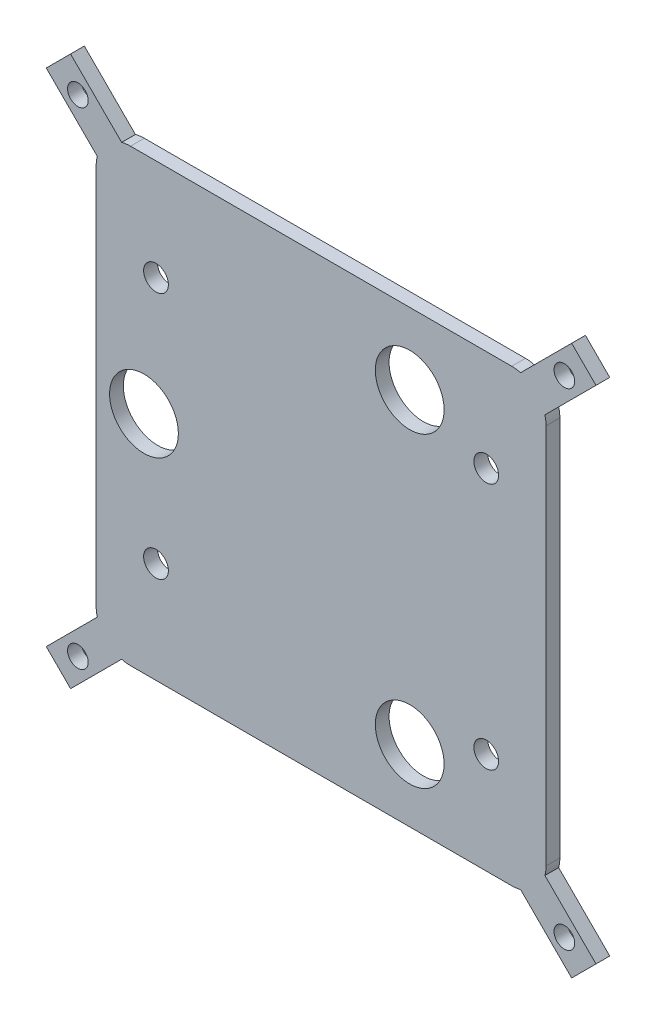
ISO-10303-21;
HEADER;
FILE_DESCRIPTION(('STEP AP214'),'2;1');
FILE_NAME('part.step','',(''),(''),'','','');
FILE_SCHEMA(('AUTOMOTIVE_DESIGN { 1 0 10303 214 1 1 1 1 }'));
ENDSEC;
DATA;
#1=APPLICATION_CONTEXT('core data for automotive mechanical design processes');
#2=APPLICATION_PROTOCOL_DEFINITION('international standard','automotive_design',2000,#1);
#3=PRODUCT_CONTEXT('',#1,'mechanical');
#4=PRODUCT('Part','Part','',(#3));
#5=PRODUCT_RELATED_PRODUCT_CATEGORY('part','',(#4));
#6=PRODUCT_DEFINITION_FORMATION('','',#4);
#7=PRODUCT_DEFINITION_CONTEXT('part definition',#1,'design');
#8=PRODUCT_DEFINITION('design','',#6,#7);
#9=PRODUCT_DEFINITION_SHAPE('','',#8);
#10=(LENGTH_UNIT() NAMED_UNIT(*) SI_UNIT(.MILLI.,.METRE.));
#11=(NAMED_UNIT(*) PLANE_ANGLE_UNIT() SI_UNIT($,.RADIAN.));
#12=(NAMED_UNIT(*) SI_UNIT($,.STERADIAN.) SOLID_ANGLE_UNIT());
#13=UNCERTAINTY_MEASURE_WITH_UNIT(LENGTH_MEASURE(1.E-05),#10,'distance_accuracy_value','');
#14=(GEOMETRIC_REPRESENTATION_CONTEXT(3) GLOBAL_UNCERTAINTY_ASSIGNED_CONTEXT((#13)) GLOBAL_UNIT_ASSIGNED_CONTEXT((#10,
#11,#12)) REPRESENTATION_CONTEXT('',''));
#15=CARTESIAN_POINT('',(0.,0.,0.));
#16=DIRECTION('',(0.,0.,1.));
#17=DIRECTION('',(1.,0.,0.));
#18=AXIS2_PLACEMENT_3D('',#15,#16,#17);
#19=CARTESIAN_POINT('',(-27.7,-27.7,2.));
#20=DIRECTION('',(0.,0.,-1.));
#21=DIRECTION('',(-1.,0.,0.));
#22=AXIS2_PLACEMENT_3D('',#19,#20,#21);
#23=CYLINDRICAL_SURFACE('',#22,5.);
#24=DIRECTION('',(0.,0.,-1.));
#25=VECTOR('',#24,1.);
#26=CARTESIAN_POINT('',(-32.529629131445,-28.9940952255139,2.));
#27=LINE('',#26,#25);
#28=CARTESIAN_POINT('',(-32.529629131445,-28.9940952255139,2.));
#29=VERTEX_POINT('',#28);
#30=CARTESIAN_POINT('',(-32.529629131445,-28.9940952255139,0.));
#31=VERTEX_POINT('',#30);
#32=EDGE_CURVE('E11',#29,#31,#27,.T.);
#33=ORIENTED_EDGE('',*,*,#32,.F.);
#34=CARTESIAN_POINT('',(-27.7,-27.7,2.));
#35=DIRECTION('',(0.,0.,1.));
#36=DIRECTION('',(1.,0.,0.));
#37=AXIS2_PLACEMENT_3D('',#34,#35,#36);
#38=CIRCLE('',#37,5.);
#39=CARTESIAN_POINT('',(-32.7,-27.7,2.));
#40=VERTEX_POINT('',#39);
#41=EDGE_CURVE('E218',#40,#29,#38,.T.);
#42=ORIENTED_EDGE('',*,*,#41,.F.);
#43=DIRECTION('',(0.,0.,-1.));
#44=VECTOR('',#43,1.);
#45=CARTESIAN_POINT('',(-32.7,-27.7,2.));
#46=LINE('',#45,#44);
#47=CARTESIAN_POINT('',(-32.7,-27.7,0.));
#48=VERTEX_POINT('',#47);
#49=EDGE_CURVE('E334',#40,#48,#46,.T.);
#50=ORIENTED_EDGE('',*,*,#49,.T.);
#51=CARTESIAN_POINT('',(-27.7,-27.7,0.));
#52=DIRECTION('',(0.,0.,1.));
#53=DIRECTION('',(1.,0.,0.));
#54=AXIS2_PLACEMENT_3D('',#51,#52,#53);
#55=CIRCLE('',#54,5.);
#56=EDGE_CURVE('E335',#48,#31,#55,.T.);
#57=ORIENTED_EDGE('',*,*,#56,.T.);
#58=EDGE_LOOP('',(#33,#42,#50,#57));
#59=FACE_BOUND('',#58,.T.);
#60=ADVANCED_FACE('F36',(#59),#23,.T.);
#61=DIRECTION('',(0.,0.,-1.));
#62=VECTOR('',#61,1.);
#63=CARTESIAN_POINT('',(-28.9940952255113,-32.5296291314457,2.));
#64=LINE('',#63,#62);
#65=CARTESIAN_POINT('',(-28.9940952255113,-32.5296291314457,0.));
#66=VERTEX_POINT('',#65);
#67=CARTESIAN_POINT('',(-28.9940952255113,-32.5296291314457,2.));
#68=VERTEX_POINT('',#67);
#69=EDGE_CURVE('E43',#66,#68,#64,.F.);
#70=ORIENTED_EDGE('',*,*,#69,.F.);
#71=CARTESIAN_POINT('',(-27.7,-32.7,0.));
#72=VERTEX_POINT('',#71);
#73=EDGE_CURVE('E310',#66,#72,#55,.T.);
#74=ORIENTED_EDGE('',*,*,#73,.T.);
#75=DIRECTION('',(0.,0.,-1.));
#76=VECTOR('',#75,1.);
#77=CARTESIAN_POINT('',(-27.7,-32.7,2.));
#78=LINE('',#77,#76);
#79=CARTESIAN_POINT('',(-27.7,-32.7,2.));
#80=VERTEX_POINT('',#79);
#81=EDGE_CURVE('E374',#80,#72,#78,.T.);
#82=ORIENTED_EDGE('',*,*,#81,.F.);
#83=EDGE_CURVE('E50',#68,#80,#38,.T.);
#84=ORIENTED_EDGE('',*,*,#83,.F.);
#85=EDGE_LOOP('',(#70,#74,#82,#84));
#86=FACE_BOUND('',#85,.T.);
#87=ADVANCED_FACE('F402',(#86),#23,.T.);
#88=CARTESIAN_POINT('',(27.7,-27.7,2.));
#89=DIRECTION('',(0.,0.,-1.));
#90=DIRECTION('',(-1.,0.,0.));
#91=AXIS2_PLACEMENT_3D('',#88,#89,#90);
#92=CYLINDRICAL_SURFACE('',#91,5.);
#93=DIRECTION('',(0.,0.,-1.));
#94=VECTOR('',#93,1.);
#95=CARTESIAN_POINT('',(28.9940952255137,-32.529629131445,2.));
#96=LINE('',#95,#94);
#97=CARTESIAN_POINT('',(28.9940952255137,-32.529629131445,2.));
#98=VERTEX_POINT('',#97);
#99=CARTESIAN_POINT('',(28.9940952255137,-32.529629131445,0.));
#100=VERTEX_POINT('',#99);
#101=EDGE_CURVE('E392',#98,#100,#96,.T.);
#102=ORIENTED_EDGE('',*,*,#101,.F.);
#103=CARTESIAN_POINT('',(27.7,-27.7,2.));
#104=DIRECTION('',(0.,0.,1.));
#105=DIRECTION('',(1.,0.,0.));
#106=AXIS2_PLACEMENT_3D('',#103,#104,#105);
#107=CIRCLE('',#106,5.);
#108=CARTESIAN_POINT('',(27.7,-32.7,2.));
#109=VERTEX_POINT('',#108);
#110=EDGE_CURVE('E317',#109,#98,#107,.T.);
#111=ORIENTED_EDGE('',*,*,#110,.F.);
#112=DIRECTION('',(0.,0.,-1.));
#113=VECTOR('',#112,1.);
#114=CARTESIAN_POINT('',(27.7,-32.7,2.));
#115=LINE('',#114,#113);
#116=CARTESIAN_POINT('',(27.7,-32.7,0.));
#117=VERTEX_POINT('',#116);
#118=EDGE_CURVE('E371',#109,#117,#115,.T.);
#119=ORIENTED_EDGE('',*,*,#118,.T.);
#120=CARTESIAN_POINT('',(27.7,-27.7,0.));
#121=DIRECTION('',(0.,0.,1.));
#122=DIRECTION('',(1.,0.,0.));
#123=AXIS2_PLACEMENT_3D('',#120,#121,#122);
#124=CIRCLE('',#123,5.);
#125=EDGE_CURVE('E340',#117,#100,#124,.T.);
#126=ORIENTED_EDGE('',*,*,#125,.T.);
#127=EDGE_LOOP('',(#102,#111,#119,#126));
#128=FACE_BOUND('',#127,.T.);
#129=ADVANCED_FACE('F410',(#128),#92,.T.);
#130=CARTESIAN_POINT('',(27.7,27.7,2.));
#131=DIRECTION('',(0.,0.,-1.));
#132=DIRECTION('',(-1.,0.,0.));
#133=AXIS2_PLACEMENT_3D('',#130,#131,#132);
#134=CYLINDRICAL_SURFACE('',#133,5.);
#135=DIRECTION('',(0.,0.,-1.));
#136=VECTOR('',#135,1.);
#137=CARTESIAN_POINT('',(32.5296291314454,28.9940952255124,2.));
#138=LINE('',#137,#136);
#139=CARTESIAN_POINT('',(32.5296291314454,28.9940952255124,2.));
#140=VERTEX_POINT('',#139);
#141=CARTESIAN_POINT('',(32.5296291314454,28.9940952255124,0.));
#142=VERTEX_POINT('',#141);
#143=EDGE_CURVE('E386',#140,#142,#138,.T.);
#144=ORIENTED_EDGE('',*,*,#143,.F.);
#145=CARTESIAN_POINT('',(27.7,27.7,2.));
#146=DIRECTION('',(0.,0.,1.));
#147=DIRECTION('',(1.,0.,0.));
#148=AXIS2_PLACEMENT_3D('',#145,#146,#147);
#149=CIRCLE('',#148,5.);
#150=CARTESIAN_POINT('',(32.7,27.7,2.));
#151=VERTEX_POINT('',#150);
#152=EDGE_CURVE('E323',#151,#140,#149,.T.);
#153=ORIENTED_EDGE('',*,*,#152,.F.);
#154=DIRECTION('',(0.,0.,-1.));
#155=VECTOR('',#154,1.);
#156=CARTESIAN_POINT('',(32.7,27.7,2.));
#157=LINE('',#156,#155);
#158=CARTESIAN_POINT('',(32.7,27.7,0.));
#159=VERTEX_POINT('',#158);
#160=EDGE_CURVE('E365',#151,#159,#157,.T.);
#161=ORIENTED_EDGE('',*,*,#160,.T.);
#162=CARTESIAN_POINT('',(27.7,27.7,0.));
#163=DIRECTION('',(0.,0.,1.));
#164=DIRECTION('',(1.,0.,0.));
#165=AXIS2_PLACEMENT_3D('',#162,#163,#164);
#166=CIRCLE('',#165,5.);
#167=EDGE_CURVE('E345',#159,#142,#166,.T.);
#168=ORIENTED_EDGE('',*,*,#167,.T.);
#169=EDGE_LOOP('',(#144,#153,#161,#168));
#170=FACE_BOUND('',#169,.T.);
#171=ADVANCED_FACE('F437',(#170),#134,.T.);
#172=CARTESIAN_POINT('',(-27.7,27.7,2.));
#173=DIRECTION('',(0.,0.,-1.));
#174=DIRECTION('',(-1.,0.,0.));
#175=AXIS2_PLACEMENT_3D('',#172,#173,#174);
#176=CYLINDRICAL_SURFACE('',#175,5.);
#177=DIRECTION('',(0.,0.,-1.));
#178=VECTOR('',#177,1.);
#179=CARTESIAN_POINT('',(-28.9940952255126,32.5296291314453,2.));
#180=LINE('',#179,#178);
#181=CARTESIAN_POINT('',(-28.9940952255126,32.5296291314453,2.));
#182=VERTEX_POINT('',#181);
#183=CARTESIAN_POINT('',(-28.9940952255126,32.5296291314453,0.));
#184=VERTEX_POINT('',#183);
#185=EDGE_CURVE('E380',#182,#184,#180,.T.);
#186=ORIENTED_EDGE('',*,*,#185,.F.);
#187=CARTESIAN_POINT('',(-27.7,27.7,2.));
#188=DIRECTION('',(0.,0.,1.));
#189=DIRECTION('',(-1.,0.,0.));
#190=AXIS2_PLACEMENT_3D('',#187,#188,#189);
#191=CIRCLE('',#190,5.);
#192=CARTESIAN_POINT('',(-27.7,32.7,2.));
#193=VERTEX_POINT('',#192);
#194=EDGE_CURVE('E329',#193,#182,#191,.T.);
#195=ORIENTED_EDGE('',*,*,#194,.F.);
#196=DIRECTION('',(0.,0.,-1.));
#197=VECTOR('',#196,1.);
#198=CARTESIAN_POINT('',(-27.7,32.7,2.));
#199=LINE('',#198,#197);
#200=CARTESIAN_POINT('',(-27.7,32.7,0.));
#201=VERTEX_POINT('',#200);
#202=EDGE_CURVE('E359',#193,#201,#199,.T.);
#203=ORIENTED_EDGE('',*,*,#202,.T.);
#204=CARTESIAN_POINT('',(-27.7,27.7,0.));
#205=DIRECTION('',(0.,0.,1.));
#206=DIRECTION('',(-1.,0.,0.));
#207=AXIS2_PLACEMENT_3D('',#204,#205,#206);
#208=CIRCLE('',#207,5.);
#209=EDGE_CURVE('E350',#201,#184,#208,.T.);
#210=ORIENTED_EDGE('',*,*,#209,.T.);
#211=EDGE_LOOP('',(#186,#195,#203,#210));
#212=FACE_BOUND('',#211,.T.);
#213=ADVANCED_FACE('F464',(#212),#176,.T.);
#214=DIRECTION('',(0.,0.,-1.));
#215=VECTOR('',#214,1.);
#216=CARTESIAN_POINT('',(-32.5296291314453,28.9940952255126,2.));
#217=LINE('',#216,#215);
#218=CARTESIAN_POINT('',(-32.5296291314453,28.9940952255126,0.));
#219=VERTEX_POINT('',#218);
#220=CARTESIAN_POINT('',(-32.5296291314453,28.9940952255126,2.));
#221=VERTEX_POINT('',#220);
#222=EDGE_CURVE('E377',#219,#221,#217,.F.);
#223=ORIENTED_EDGE('',*,*,#222,.F.);
#224=CARTESIAN_POINT('',(-32.7,27.7,0.));
#225=VERTEX_POINT('',#224);
#226=EDGE_CURVE('E349',#219,#225,#208,.T.);
#227=ORIENTED_EDGE('',*,*,#226,.T.);
#228=DIRECTION('',(0.,0.,-1.));
#229=VECTOR('',#228,1.);
#230=CARTESIAN_POINT('',(-32.7,27.7,2.));
#231=LINE('',#230,#229);
#232=CARTESIAN_POINT('',(-32.7,27.7,2.));
#233=VERTEX_POINT('',#232);
#234=EDGE_CURVE('E356',#233,#225,#231,.T.);
#235=ORIENTED_EDGE('',*,*,#234,.F.);
#236=EDGE_CURVE('E328',#221,#233,#191,.T.);
#237=ORIENTED_EDGE('',*,*,#236,.F.);
#238=EDGE_LOOP('',(#223,#227,#235,#237));
#239=FACE_BOUND('',#238,.T.);
#240=ADVANCED_FACE('F480',(#239),#176,.T.);
#241=CARTESIAN_POINT('',(-27.7,-27.7,2.));
#242=DIRECTION('',(0.,0.,1.));
#243=DIRECTION('',(1.,0.,0.));
#244=AXIS2_PLACEMENT_3D('',#241,#242,#243);
#245=PLANE('',#244);
#246=CARTESIAN_POINT('',(12.8749999999999,22.3001541474493,2.));
#247=DIRECTION('',(0.,0.,1.));
#248=DIRECTION('',(1.,0.,0.));
#249=AXIS2_PLACEMENT_3D('',#246,#247,#248);
#250=CIRCLE('',#249,5.);
#251=CARTESIAN_POINT('',(17.8749999999999,22.3001541474493,2.));
#252=VERTEX_POINT('',#251);
#253=EDGE_CURVE('E838',#252,#252,#250,.T.);
#254=ORIENTED_EDGE('',*,*,#253,.F.);
#255=EDGE_LOOP('',(#254));
#256=FACE_BOUND('',#255,.T.);
#257=CARTESIAN_POINT('',(-25.75,-1.89271685473835E-13,2.));
#258=DIRECTION('',(0.,0.,1.));
#259=DIRECTION('',(1.,0.,0.));
#260=AXIS2_PLACEMENT_3D('',#257,#258,#259);
#261=CIRCLE('',#260,5.);
#262=CARTESIAN_POINT('',(-20.75,-1.89271685473835E-13,2.));
#263=VERTEX_POINT('',#262);
#264=EDGE_CURVE('E849',#263,#263,#261,.T.);
#265=ORIENTED_EDGE('',*,*,#264,.F.);
#266=EDGE_LOOP('',(#265));
#267=FACE_BOUND('',#266,.T.);
#268=CARTESIAN_POINT('',(12.875,-22.3001541474493,2.));
#269=DIRECTION('',(0.,0.,1.));
#270=DIRECTION('',(1.,0.,0.));
#271=AXIS2_PLACEMENT_3D('',#268,#269,#270);
#272=CIRCLE('',#271,5.);
#273=CARTESIAN_POINT('',(17.875,-22.3001541474493,2.));
#274=VERTEX_POINT('',#273);
#275=EDGE_CURVE('E855',#274,#274,#272,.T.);
#276=ORIENTED_EDGE('',*,*,#275,.F.);
#277=EDGE_LOOP('',(#276));
#278=FACE_BOUND('',#277,.T.);
#279=CARTESIAN_POINT('',(-35.3553390593254,-35.3553390593274,2.));
#280=DIRECTION('',(0.,0.,1.));
#281=DIRECTION('',(1.,0.,0.));
#282=AXIS2_PLACEMENT_3D('',#279,#280,#281);
#283=CIRCLE('',#282,1.5);
#284=CARTESIAN_POINT('',(-33.8553390593254,-35.3553390593274,2.));
#285=VERTEX_POINT('',#284);
#286=EDGE_CURVE('E844',#285,#285,#283,.T.);
#287=ORIENTED_EDGE('',*,*,#286,.F.);
#288=EDGE_LOOP('',(#287));
#289=FACE_BOUND('',#288,.T.);
#290=CARTESIAN_POINT('',(35.3553390593294,-35.3553390593254,2.));
#291=DIRECTION('',(0.,0.,1.));
#292=DIRECTION('',(1.,0.,0.));
#293=AXIS2_PLACEMENT_3D('',#290,#291,#292);
#294=CIRCLE('',#293,1.5);
#295=CARTESIAN_POINT('',(36.8553390593294,-35.3553390593254,2.));
#296=VERTEX_POINT('',#295);
#297=EDGE_CURVE('E864',#296,#296,#294,.T.);
#298=ORIENTED_EDGE('',*,*,#297,.F.);
#299=EDGE_LOOP('',(#298));
#300=FACE_BOUND('',#299,.T.);
#301=CARTESIAN_POINT('',(35.3553390593274,35.3553390593294,2.));
#302=DIRECTION('',(0.,0.,1.));
#303=DIRECTION('',(1.,0.,0.));
#304=AXIS2_PLACEMENT_3D('',#301,#302,#303);
#305=CIRCLE('',#304,1.5);
#306=CARTESIAN_POINT('',(36.8553390593274,35.3553390593294,2.));
#307=VERTEX_POINT('',#306);
#308=EDGE_CURVE('E863',#307,#307,#305,.T.);
#309=ORIENTED_EDGE('',*,*,#308,.F.);
#310=EDGE_LOOP('',(#309));
#311=FACE_BOUND('',#310,.T.);
#312=CARTESIAN_POINT('',(-35.3553390593274,35.3553390593274,2.));
#313=DIRECTION('',(0.,0.,1.));
#314=DIRECTION('',(1.,0.,0.));
#315=AXIS2_PLACEMENT_3D('',#312,#313,#314);
#316=CIRCLE('',#315,1.5);
#317=CARTESIAN_POINT('',(-33.8553390593274,35.3553390593274,2.));
#318=VERTEX_POINT('',#317);
#319=EDGE_CURVE('E867',#318,#318,#316,.T.);
#320=ORIENTED_EDGE('',*,*,#319,.F.);
#321=EDGE_LOOP('',(#320));
#322=FACE_BOUND('',#321,.T.);
#323=ORIENTED_EDGE('',*,*,#41,.T.);
#324=DIRECTION('',(0.707106781186546,0.707106781186549,0.));
#325=VECTOR('',#324,1.);
#326=CARTESIAN_POINT('',(-1.76776695296559,1.76776695296558,2.));
#327=LINE('',#326,#325);
#328=CARTESIAN_POINT('',(-39.9515331370392,-36.4159992311082,2.));
#329=VERTEX_POINT('',#328);
#330=EDGE_CURVE('E200',#329,#29,#327,.T.);
#331=ORIENTED_EDGE('',*,*,#330,.F.);
#332=DIRECTION('',(-0.707106781186548,0.707106781186548,0.));
#333=VECTOR('',#332,1.);
#334=CARTESIAN_POINT('',(-38.1837661840737,-38.1837661840737,2.));
#335=LINE('',#334,#333);
#336=CARTESIAN_POINT('',(-36.4159992311065,-39.9515331370409,2.));
#337=VERTEX_POINT('',#336);
#338=EDGE_CURVE('E207',#337,#329,#335,.T.);
#339=ORIENTED_EDGE('',*,*,#338,.F.);
#340=DIRECTION('',(-0.707106781186547,-0.707106781186548,0.));
#341=VECTOR('',#340,1.);
#342=CARTESIAN_POINT('',(1.7677669529672,-1.76776695296719,2.));
#343=LINE('',#342,#341);
#344=EDGE_CURVE('E219',#68,#337,#343,.T.);
#345=ORIENTED_EDGE('',*,*,#344,.F.);
#346=ORIENTED_EDGE('',*,*,#83,.T.);
#347=DIRECTION('',(1.,0.,0.));
#348=VECTOR('',#347,1.);
#349=CARTESIAN_POINT('',(-27.7,-32.7,2.));
#350=LINE('',#349,#348);
#351=EDGE_CURVE('E314',#80,#109,#350,.T.);
#352=ORIENTED_EDGE('',*,*,#351,.T.);
#353=ORIENTED_EDGE('',*,*,#110,.T.);
#354=DIRECTION('',(-0.70710678118655,0.707106781186545,0.));
#355=VECTOR('',#354,1.);
#356=CARTESIAN_POINT('',(-1.76776695296577,-1.76776695296578,2.));
#357=LINE('',#356,#355);
#358=CARTESIAN_POINT('',(36.4159992311089,-39.9515331370402,2.));
#359=VERTEX_POINT('',#358);
#360=EDGE_CURVE('E233',#359,#98,#357,.T.);
#361=ORIENTED_EDGE('',*,*,#360,.F.);
#362=DIRECTION('',(-0.707106781186548,-0.707106781186548,0.));
#363=VECTOR('',#362,1.);
#364=CARTESIAN_POINT('',(38.1837661840745,-38.1837661840745,2.));
#365=LINE('',#364,#363);
#366=CARTESIAN_POINT('',(39.9515331370416,-36.4159992311075,2.));
#367=VERTEX_POINT('',#366);
#368=EDGE_CURVE('E236',#367,#359,#365,.T.);
#369=ORIENTED_EDGE('',*,*,#368,.F.);
#370=DIRECTION('',(-0.707106781186551,0.707106781186544,0.));
#371=VECTOR('',#370,1.);
#372=CARTESIAN_POINT('',(1.76776695296694,1.76776695296695,2.));
#373=LINE('',#372,#371);
#374=CARTESIAN_POINT('',(32.5296291314456,-28.9940952255115,2.));
#375=VERTEX_POINT('',#374);
#376=EDGE_CURVE('E240',#367,#375,#373,.T.);
#377=ORIENTED_EDGE('',*,*,#376,.T.);
#378=CARTESIAN_POINT('',(32.7,-27.7,2.));
#379=VERTEX_POINT('',#378);
#380=EDGE_CURVE('E316',#375,#379,#107,.T.);
#381=ORIENTED_EDGE('',*,*,#380,.T.);
#382=DIRECTION('',(0.,1.,0.));
#383=VECTOR('',#382,1.);
#384=CARTESIAN_POINT('',(32.7,-27.7,2.));
#385=LINE('',#384,#383);
#386=EDGE_CURVE('E320',#379,#151,#385,.T.);
#387=ORIENTED_EDGE('',*,*,#386,.T.);
#388=ORIENTED_EDGE('',*,*,#152,.T.);
#389=DIRECTION('',(-0.707106781186544,-0.707106781186551,0.));
#390=VECTOR('',#389,1.);
#391=CARTESIAN_POINT('',(1.76776695296663,-1.76776695296662,2.));
#392=LINE('',#391,#390);
#393=CARTESIAN_POINT('',(39.9515331370409,36.4159992311079,2.));
#394=VERTEX_POINT('',#393);
#395=EDGE_CURVE('E232',#394,#140,#392,.T.);
#396=ORIENTED_EDGE('',*,*,#395,.F.);
#397=DIRECTION('',(0.707106781186548,-0.707106781186548,0.));
#398=VECTOR('',#397,1.);
#399=CARTESIAN_POINT('',(38.1837661840744,38.1837661840744,2.));
#400=LINE('',#399,#398);
#401=CARTESIAN_POINT('',(36.4159992311082,39.9515331370406,2.));
#402=VERTEX_POINT('',#401);
#403=EDGE_CURVE('E257',#402,#394,#400,.T.);
#404=ORIENTED_EDGE('',*,*,#403,.F.);
#405=DIRECTION('',(-0.707106781186545,-0.70710678118655,0.));
#406=VECTOR('',#405,1.);
#407=CARTESIAN_POINT('',(-1.76776695296614,1.76776695296613,2.));
#408=LINE('',#407,#406);
#409=CARTESIAN_POINT('',(28.9940952255128,32.5296291314453,2.));
#410=VERTEX_POINT('',#409);
#411=EDGE_CURVE('E260',#402,#410,#408,.T.);
#412=ORIENTED_EDGE('',*,*,#411,.T.);
#413=CARTESIAN_POINT('',(27.7,32.7,2.));
#414=VERTEX_POINT('',#413);
#415=EDGE_CURVE('E322',#410,#414,#149,.T.);
#416=ORIENTED_EDGE('',*,*,#415,.T.);
#417=DIRECTION('',(-1.,0.,0.));
#418=VECTOR('',#417,1.);
#419=CARTESIAN_POINT('',(-27.7,32.7,2.));
#420=LINE('',#419,#418);
#421=EDGE_CURVE('E326',#414,#193,#420,.T.);
#422=ORIENTED_EDGE('',*,*,#421,.T.);
#423=ORIENTED_EDGE('',*,*,#194,.T.);
#424=DIRECTION('',(0.707106781186547,-0.707106781186548,0.));
#425=VECTOR('',#424,1.);
#426=CARTESIAN_POINT('',(1.76776695296634,1.76776695296634,2.));
#427=LINE('',#426,#425);
#428=CARTESIAN_POINT('',(-36.4159992311072,39.9515331370399,2.));
#429=VERTEX_POINT('',#428);
#430=EDGE_CURVE('E279',#429,#182,#427,.T.);
#431=ORIENTED_EDGE('',*,*,#430,.F.);
#432=DIRECTION('',(0.707106781186548,0.707106781186548,0.));
#433=VECTOR('',#432,1.);
#434=CARTESIAN_POINT('',(-38.1837661840736,38.1837661840736,2.));
#435=LINE('',#434,#433);
#436=CARTESIAN_POINT('',(-39.9515331370399,36.4159992311072,2.));
#437=VERTEX_POINT('',#436);
#438=EDGE_CURVE('E282',#437,#429,#435,.T.);
#439=ORIENTED_EDGE('',*,*,#438,.F.);
#440=DIRECTION('',(-0.707106781186547,0.707106781186548,0.));
#441=VECTOR('',#440,1.);
#442=CARTESIAN_POINT('',(-1.76776695296638,-1.76776695296638,2.));
#443=LINE('',#442,#441);
#444=EDGE_CURVE('E254',#221,#437,#443,.T.);
#445=ORIENTED_EDGE('',*,*,#444,.F.);
#446=ORIENTED_EDGE('',*,*,#236,.T.);
#447=DIRECTION('',(0.,-1.,0.));
#448=VECTOR('',#447,1.);
#449=CARTESIAN_POINT('',(-32.7,-27.7,2.));
#450=LINE('',#449,#448);
#451=EDGE_CURVE('E332',#233,#40,#450,.T.);
#452=ORIENTED_EDGE('',*,*,#451,.T.);
#453=EDGE_LOOP('',(#323,#331,#339,#345,#346,#352,#353,#361,#369,#377,#381,#387,#388,#396,#404,
#412,#416,#422,#423,#431,#439,#445,#446,#452));
#454=FACE_BOUND('',#453,.T.);
#455=CARTESIAN_POINT('',(-24.,-18.,2.));
#456=DIRECTION('',(0.,0.,1.));
#457=DIRECTION('',(1.,0.,0.));
#458=AXIS2_PLACEMENT_3D('',#455,#456,#457);
#459=CIRCLE('',#458,1.80000000000001);
#460=CARTESIAN_POINT('',(-22.2,-18.,2.));
#461=VERTEX_POINT('',#460);
#462=EDGE_CURVE('E295',#461,#461,#459,.T.);
#463=ORIENTED_EDGE('',*,*,#462,.F.);
#464=EDGE_LOOP('',(#463));
#465=FACE_BOUND('',#464,.T.);
#466=CARTESIAN_POINT('',(24.,18.,2.));
#467=DIRECTION('',(0.,0.,1.));
#468=DIRECTION('',(1.,0.,0.));
#469=AXIS2_PLACEMENT_3D('',#466,#467,#468);
#470=CIRCLE('',#469,1.80000000000004);
#471=CARTESIAN_POINT('',(25.8,18.,2.));
#472=VERTEX_POINT('',#471);
#473=EDGE_CURVE('E307',#472,#472,#470,.T.);
#474=ORIENTED_EDGE('',*,*,#473,.F.);
#475=EDGE_LOOP('',(#474));
#476=FACE_BOUND('',#475,.T.);
#477=CARTESIAN_POINT('',(-24.,18.,2.));
#478=DIRECTION('',(0.,0.,1.));
#479=DIRECTION('',(1.,0.,0.));
#480=AXIS2_PLACEMENT_3D('',#477,#478,#479);
#481=CIRCLE('',#480,1.80000000000001);
#482=CARTESIAN_POINT('',(-22.2,18.,2.));
#483=VERTEX_POINT('',#482);
#484=EDGE_CURVE('E301',#483,#483,#481,.T.);
#485=ORIENTED_EDGE('',*,*,#484,.F.);
#486=EDGE_LOOP('',(#485));
#487=FACE_BOUND('',#486,.T.);
#488=CARTESIAN_POINT('',(24.,-18.,2.));
#489=DIRECTION('',(0.,0.,1.));
#490=DIRECTION('',(1.,0.,0.));
#491=AXIS2_PLACEMENT_3D('',#488,#489,#490);
#492=CIRCLE('',#491,1.80000000000004);
#493=CARTESIAN_POINT('',(25.8,-18.,2.));
#494=VERTEX_POINT('',#493);
#495=EDGE_CURVE('E289',#494,#494,#492,.T.);
#496=ORIENTED_EDGE('',*,*,#495,.F.);
#497=EDGE_LOOP('',(#496));
#498=FACE_BOUND('',#497,.T.);
#499=ADVANCED_FACE('F216',(#256,#267,#278,#289,#300,#311,#322,#454,#465,#476,#487,#498),#245,.T.);
#500=CARTESIAN_POINT('',(-27.7,-27.7,0.));
#501=DIRECTION('',(0.,0.,1.));
#502=DIRECTION('',(1.,0.,0.));
#503=AXIS2_PLACEMENT_3D('',#500,#501,#502);
#504=PLANE('',#503);
#505=CARTESIAN_POINT('',(12.8749999999999,22.3001541474493,0.));
#506=DIRECTION('',(0.,0.,1.));
#507=DIRECTION('',(1.,0.,0.));
#508=AXIS2_PLACEMENT_3D('',#505,#506,#507);
#509=CIRCLE('',#508,5.);
#510=CARTESIAN_POINT('',(17.8749999999999,22.3001541474493,0.));
#511=VERTEX_POINT('',#510);
#512=EDGE_CURVE('E840',#511,#511,#509,.F.);
#513=ORIENTED_EDGE('',*,*,#512,.F.);
#514=EDGE_LOOP('',(#513));
#515=FACE_BOUND('',#514,.T.);
#516=CARTESIAN_POINT('',(-25.75,-1.89271685473835E-13,0.));
#517=DIRECTION('',(0.,0.,1.));
#518=DIRECTION('',(1.,0.,0.));
#519=AXIS2_PLACEMENT_3D('',#516,#517,#518);
#520=CIRCLE('',#519,5.);
#521=CARTESIAN_POINT('',(-20.75,-1.89271685473835E-13,0.));
#522=VERTEX_POINT('',#521);
#523=EDGE_CURVE('E846',#522,#522,#520,.F.);
#524=ORIENTED_EDGE('',*,*,#523,.F.);
#525=EDGE_LOOP('',(#524));
#526=FACE_BOUND('',#525,.T.);
#527=CARTESIAN_POINT('',(12.875,-22.3001541474493,0.));
#528=DIRECTION('',(0.,0.,1.));
#529=DIRECTION('',(1.,0.,0.));
#530=AXIS2_PLACEMENT_3D('',#527,#528,#529);
#531=CIRCLE('',#530,5.);
#532=CARTESIAN_POINT('',(17.875,-22.3001541474493,0.));
#533=VERTEX_POINT('',#532);
#534=EDGE_CURVE('E852',#533,#533,#531,.F.);
#535=ORIENTED_EDGE('',*,*,#534,.F.);
#536=EDGE_LOOP('',(#535));
#537=FACE_BOUND('',#536,.T.);
#538=CARTESIAN_POINT('',(-35.3553390593254,-35.3553390593274,0.));
#539=DIRECTION('',(0.,0.,1.));
#540=DIRECTION('',(1.,0.,0.));
#541=AXIS2_PLACEMENT_3D('',#538,#539,#540);
#542=CIRCLE('',#541,1.5);
#543=CARTESIAN_POINT('',(-33.8553390593254,-35.3553390593274,0.));
#544=VERTEX_POINT('',#543);
#545=EDGE_CURVE('E841',#544,#544,#542,.F.);
#546=ORIENTED_EDGE('',*,*,#545,.F.);
#547=EDGE_LOOP('',(#546));
#548=FACE_BOUND('',#547,.T.);
#549=CARTESIAN_POINT('',(35.3553390593294,-35.3553390593254,0.));
#550=DIRECTION('',(0.,0.,1.));
#551=DIRECTION('',(1.,0.,0.));
#552=AXIS2_PLACEMENT_3D('',#549,#550,#551);
#553=CIRCLE('',#552,1.5);
#554=CARTESIAN_POINT('',(36.8553390593294,-35.3553390593254,0.));
#555=VERTEX_POINT('',#554);
#556=EDGE_CURVE('E868',#555,#555,#553,.F.);
#557=ORIENTED_EDGE('',*,*,#556,.F.);
#558=EDGE_LOOP('',(#557));
#559=FACE_BOUND('',#558,.T.);
#560=CARTESIAN_POINT('',(35.3553390593274,35.3553390593294,0.));
#561=DIRECTION('',(0.,0.,1.));
#562=DIRECTION('',(1.,0.,0.));
#563=AXIS2_PLACEMENT_3D('',#560,#561,#562);
#564=CIRCLE('',#563,1.5);
#565=CARTESIAN_POINT('',(36.8553390593274,35.3553390593294,0.));
#566=VERTEX_POINT('',#565);
#567=EDGE_CURVE('E860',#566,#566,#564,.F.);
#568=ORIENTED_EDGE('',*,*,#567,.F.);
#569=EDGE_LOOP('',(#568));
#570=FACE_BOUND('',#569,.T.);
#571=CARTESIAN_POINT('',(-35.3553390593274,35.3553390593274,0.));
#572=DIRECTION('',(0.,0.,1.));
#573=DIRECTION('',(1.,0.,0.));
#574=AXIS2_PLACEMENT_3D('',#571,#572,#573);
#575=CIRCLE('',#574,1.5);
#576=CARTESIAN_POINT('',(-33.8553390593274,35.3553390593274,0.));
#577=VERTEX_POINT('',#576);
#578=EDGE_CURVE('E221',#577,#577,#575,.F.);
#579=ORIENTED_EDGE('',*,*,#578,.F.);
#580=EDGE_LOOP('',(#579));
#581=FACE_BOUND('',#580,.T.);
#582=DIRECTION('',(-0.707106781186546,-0.707106781186549,0.));
#583=VECTOR('',#582,1.);
#584=CARTESIAN_POINT('',(-1.76776695296559,1.76776695296558,0.));
#585=LINE('',#584,#583);
#586=CARTESIAN_POINT('',(-39.9515331370392,-36.4159992311082,0.));
#587=VERTEX_POINT('',#586);
#588=EDGE_CURVE('E202',#31,#587,#585,.T.);
#589=ORIENTED_EDGE('',*,*,#588,.F.);
#590=ORIENTED_EDGE('',*,*,#56,.F.);
#591=DIRECTION('',(0.,-1.,0.));
#592=VECTOR('',#591,1.);
#593=CARTESIAN_POINT('',(-32.7,-27.7,0.));
#594=LINE('',#593,#592);
#595=EDGE_CURVE('E352',#225,#48,#594,.T.);
#596=ORIENTED_EDGE('',*,*,#595,.F.);
#597=ORIENTED_EDGE('',*,*,#226,.F.);
#598=DIRECTION('',(0.707106781186547,-0.707106781186548,0.));
#599=VECTOR('',#598,1.);
#600=CARTESIAN_POINT('',(-1.76776695296638,-1.76776695296638,0.));
#601=LINE('',#600,#599);
#602=CARTESIAN_POINT('',(-39.9515331370399,36.4159992311072,0.));
#603=VERTEX_POINT('',#602);
#604=EDGE_CURVE('E274',#603,#219,#601,.T.);
#605=ORIENTED_EDGE('',*,*,#604,.F.);
#606=DIRECTION('',(-0.707106781186548,-0.707106781186548,0.));
#607=VECTOR('',#606,1.);
#608=CARTESIAN_POINT('',(-38.1837661840736,38.1837661840736,0.));
#609=LINE('',#608,#607);
#610=CARTESIAN_POINT('',(-36.4159992311072,39.9515331370399,0.));
#611=VERTEX_POINT('',#610);
#612=EDGE_CURVE('E270',#611,#603,#609,.T.);
#613=ORIENTED_EDGE('',*,*,#612,.F.);
#614=DIRECTION('',(-0.707106781186547,0.707106781186548,0.));
#615=VECTOR('',#614,1.);
#616=CARTESIAN_POINT('',(1.76776695296634,1.76776695296634,0.));
#617=LINE('',#616,#615);
#618=EDGE_CURVE('E268',#184,#611,#617,.T.);
#619=ORIENTED_EDGE('',*,*,#618,.F.);
#620=ORIENTED_EDGE('',*,*,#209,.F.);
#621=DIRECTION('',(-1.,0.,0.));
#622=VECTOR('',#621,1.);
#623=CARTESIAN_POINT('',(-27.7,32.7,0.));
#624=LINE('',#623,#622);
#625=CARTESIAN_POINT('',(27.7,32.7,0.));
#626=VERTEX_POINT('',#625);
#627=EDGE_CURVE('E347',#626,#201,#624,.T.);
#628=ORIENTED_EDGE('',*,*,#627,.F.);
#629=CARTESIAN_POINT('',(28.9940952255128,32.5296291314453,0.));
#630=VERTEX_POINT('',#629);
#631=EDGE_CURVE('E344',#630,#626,#166,.T.);
#632=ORIENTED_EDGE('',*,*,#631,.F.);
#633=DIRECTION('',(0.707106781186545,0.70710678118655,0.));
#634=VECTOR('',#633,1.);
#635=CARTESIAN_POINT('',(-1.76776695296614,1.76776695296613,0.));
#636=LINE('',#635,#634);
#637=CARTESIAN_POINT('',(36.4159992311082,39.9515331370406,0.));
#638=VERTEX_POINT('',#637);
#639=EDGE_CURVE('E251',#630,#638,#636,.T.);
#640=ORIENTED_EDGE('',*,*,#639,.T.);
#641=DIRECTION('',(-0.707106781186548,0.707106781186548,0.));
#642=VECTOR('',#641,1.);
#643=CARTESIAN_POINT('',(38.1837661840744,38.1837661840744,0.));
#644=LINE('',#643,#642);
#645=CARTESIAN_POINT('',(39.9515331370409,36.4159992311079,0.));
#646=VERTEX_POINT('',#645);
#647=EDGE_CURVE('E248',#646,#638,#644,.T.);
#648=ORIENTED_EDGE('',*,*,#647,.F.);
#649=DIRECTION('',(0.707106781186544,0.707106781186551,0.));
#650=VECTOR('',#649,1.);
#651=CARTESIAN_POINT('',(1.76776695296663,-1.76776695296662,0.));
#652=LINE('',#651,#650);
#653=EDGE_CURVE('E252',#142,#646,#652,.T.);
#654=ORIENTED_EDGE('',*,*,#653,.F.);
#655=ORIENTED_EDGE('',*,*,#167,.F.);
#656=DIRECTION('',(0.,1.,0.));
#657=VECTOR('',#656,1.);
#658=CARTESIAN_POINT('',(32.7,-27.7,0.));
#659=LINE('',#658,#657);
#660=CARTESIAN_POINT('',(32.7,-27.7,0.));
#661=VERTEX_POINT('',#660);
#662=EDGE_CURVE('E342',#661,#159,#659,.T.);
#663=ORIENTED_EDGE('',*,*,#662,.F.);
#664=CARTESIAN_POINT('',(32.5296291314456,-28.9940952255115,0.));
#665=VERTEX_POINT('',#664);
#666=EDGE_CURVE('E339',#665,#661,#124,.T.);
#667=ORIENTED_EDGE('',*,*,#666,.F.);
#668=DIRECTION('',(0.707106781186551,-0.707106781186544,0.));
#669=VECTOR('',#668,1.);
#670=CARTESIAN_POINT('',(1.76776695296694,1.76776695296695,0.));
#671=LINE('',#670,#669);
#672=CARTESIAN_POINT('',(39.9515331370416,-36.4159992311075,0.));
#673=VERTEX_POINT('',#672);
#674=EDGE_CURVE('E229',#665,#673,#671,.T.);
#675=ORIENTED_EDGE('',*,*,#674,.T.);
#676=DIRECTION('',(0.707106781186548,0.707106781186548,0.));
#677=VECTOR('',#676,1.);
#678=CARTESIAN_POINT('',(38.1837661840745,-38.1837661840745,0.));
#679=LINE('',#678,#677);
#680=CARTESIAN_POINT('',(36.4159992311089,-39.9515331370402,0.));
#681=VERTEX_POINT('',#680);
#682=EDGE_CURVE('E226',#681,#673,#679,.T.);
#683=ORIENTED_EDGE('',*,*,#682,.F.);
#684=DIRECTION('',(0.70710678118655,-0.707106781186545,0.));
#685=VECTOR('',#684,1.);
#686=CARTESIAN_POINT('',(-1.76776695296577,-1.76776695296578,0.));
#687=LINE('',#686,#685);
#688=EDGE_CURVE('E230',#100,#681,#687,.T.);
#689=ORIENTED_EDGE('',*,*,#688,.F.);
#690=ORIENTED_EDGE('',*,*,#125,.F.);
#691=DIRECTION('',(1.,0.,0.));
#692=VECTOR('',#691,1.);
#693=CARTESIAN_POINT('',(-27.7,-32.7,0.));
#694=LINE('',#693,#692);
#695=EDGE_CURVE('E337',#72,#117,#694,.T.);
#696=ORIENTED_EDGE('',*,*,#695,.F.);
#697=ORIENTED_EDGE('',*,*,#73,.F.);
#698=DIRECTION('',(0.707106781186547,0.707106781186548,0.));
#699=VECTOR('',#698,1.);
#700=CARTESIAN_POINT('',(1.7677669529672,-1.76776695296719,0.));
#701=LINE('',#700,#699);
#702=CARTESIAN_POINT('',(-36.4159992311065,-39.9515331370409,0.));
#703=VERTEX_POINT('',#702);
#704=EDGE_CURVE('E237',#703,#66,#701,.T.);
#705=ORIENTED_EDGE('',*,*,#704,.F.);
#706=DIRECTION('',(0.707106781186548,-0.707106781186548,0.));
#707=VECTOR('',#706,1.);
#708=CARTESIAN_POINT('',(-38.1837661840737,-38.1837661840737,0.));
#709=LINE('',#708,#707);
#710=EDGE_CURVE('E880',#587,#703,#709,.T.);
#711=ORIENTED_EDGE('',*,*,#710,.F.);
#712=EDGE_LOOP('',(#589,#590,#596,#597,#605,#613,#619,#620,#628,#632,#640,#648,#654,#655,#663,
#667,#675,#683,#689,#690,#696,#697,#705,#711));
#713=FACE_BOUND('',#712,.T.);
#714=CARTESIAN_POINT('',(24.,18.,0.));
#715=DIRECTION('',(0.,0.,1.));
#716=DIRECTION('',(1.,0.,0.));
#717=AXIS2_PLACEMENT_3D('',#714,#715,#716);
#718=CIRCLE('',#717,1.80000000000004);
#719=CARTESIAN_POINT('',(25.8,18.,0.));
#720=VERTEX_POINT('',#719);
#721=EDGE_CURVE('E304',#720,#720,#718,.T.);
#722=ORIENTED_EDGE('',*,*,#721,.T.);
#723=EDGE_LOOP('',(#722));
#724=FACE_BOUND('',#723,.T.);
#725=CARTESIAN_POINT('',(-24.,18.,0.));
#726=DIRECTION('',(0.,0.,1.));
#727=DIRECTION('',(1.,0.,0.));
#728=AXIS2_PLACEMENT_3D('',#725,#726,#727);
#729=CIRCLE('',#728,1.80000000000001);
#730=CARTESIAN_POINT('',(-22.2,18.,0.));
#731=VERTEX_POINT('',#730);
#732=EDGE_CURVE('E298',#731,#731,#729,.T.);
#733=ORIENTED_EDGE('',*,*,#732,.T.);
#734=EDGE_LOOP('',(#733));
#735=FACE_BOUND('',#734,.T.);
#736=CARTESIAN_POINT('',(-24.,-18.,0.));
#737=DIRECTION('',(0.,0.,1.));
#738=DIRECTION('',(1.,0.,0.));
#739=AXIS2_PLACEMENT_3D('',#736,#737,#738);
#740=CIRCLE('',#739,1.80000000000001);
#741=CARTESIAN_POINT('',(-22.2,-18.,0.));
#742=VERTEX_POINT('',#741);
#743=EDGE_CURVE('E292',#742,#742,#740,.T.);
#744=ORIENTED_EDGE('',*,*,#743,.T.);
#745=EDGE_LOOP('',(#744));
#746=FACE_BOUND('',#745,.T.);
#747=CARTESIAN_POINT('',(24.,-18.,0.));
#748=DIRECTION('',(0.,0.,1.));
#749=DIRECTION('',(1.,0.,0.));
#750=AXIS2_PLACEMENT_3D('',#747,#748,#749);
#751=CIRCLE('',#750,1.80000000000004);
#752=CARTESIAN_POINT('',(25.8,-18.,0.));
#753=VERTEX_POINT('',#752);
#754=EDGE_CURVE('E277',#753,#753,#751,.T.);
#755=ORIENTED_EDGE('',*,*,#754,.T.);
#756=EDGE_LOOP('',(#755));
#757=FACE_BOUND('',#756,.T.);
#758=ADVANCED_FACE('F406',(#515,#526,#537,#548,#559,#570,#581,#713,#724,#735,#746,#757),#504,.F.);
#759=CARTESIAN_POINT('',(-27.7,-32.7,2.));
#760=DIRECTION('',(0.,1.,0.));
#761=DIRECTION('',(0.,0.,1.));
#762=AXIS2_PLACEMENT_3D('',#759,#760,#761);
#763=PLANE('',#762);
#764=ORIENTED_EDGE('',*,*,#695,.T.);
#765=ORIENTED_EDGE('',*,*,#118,.F.);
#766=ORIENTED_EDGE('',*,*,#351,.F.);
#767=ORIENTED_EDGE('',*,*,#81,.T.);
#768=EDGE_LOOP('',(#764,#765,#766,#767));
#769=FACE_BOUND('',#768,.T.);
#770=ADVANCED_FACE('F400',(#769),#763,.F.);
#771=ORIENTED_EDGE('',*,*,#380,.F.);
#772=DIRECTION('',(0.,0.,-1.));
#773=VECTOR('',#772,1.);
#774=CARTESIAN_POINT('',(32.5296291314456,-28.9940952255115,2.));
#775=LINE('',#774,#773);
#776=EDGE_CURVE('E389',#375,#665,#775,.T.);
#777=ORIENTED_EDGE('',*,*,#776,.T.);
#778=ORIENTED_EDGE('',*,*,#666,.T.);
#779=DIRECTION('',(0.,0.,-1.));
#780=VECTOR('',#779,1.);
#781=CARTESIAN_POINT('',(32.7,-27.7,2.));
#782=LINE('',#781,#780);
#783=EDGE_CURVE('E368',#379,#661,#782,.T.);
#784=ORIENTED_EDGE('',*,*,#783,.F.);
#785=EDGE_LOOP('',(#771,#777,#778,#784));
#786=FACE_BOUND('',#785,.T.);
#787=ADVANCED_FACE('F426',(#786),#92,.T.);
#788=CARTESIAN_POINT('',(32.7,-27.7,2.));
#789=DIRECTION('',(-1.,0.,0.));
#790=DIRECTION('',(0.,0.,1.));
#791=AXIS2_PLACEMENT_3D('',#788,#789,#790);
#792=PLANE('',#791);
#793=ORIENTED_EDGE('',*,*,#662,.T.);
#794=ORIENTED_EDGE('',*,*,#160,.F.);
#795=ORIENTED_EDGE('',*,*,#386,.F.);
#796=ORIENTED_EDGE('',*,*,#783,.T.);
#797=EDGE_LOOP('',(#793,#794,#795,#796));
#798=FACE_BOUND('',#797,.T.);
#799=ADVANCED_FACE('F433',(#798),#792,.F.);
#800=ORIENTED_EDGE('',*,*,#415,.F.);
#801=DIRECTION('',(0.,0.,-1.));
#802=VECTOR('',#801,1.);
#803=CARTESIAN_POINT('',(28.9940952255128,32.5296291314453,2.));
#804=LINE('',#803,#802);
#805=EDGE_CURVE('E383',#410,#630,#804,.T.);
#806=ORIENTED_EDGE('',*,*,#805,.T.);
#807=ORIENTED_EDGE('',*,*,#631,.T.);
#808=DIRECTION('',(0.,0.,-1.));
#809=VECTOR('',#808,1.);
#810=CARTESIAN_POINT('',(27.7,32.7,2.));
#811=LINE('',#810,#809);
#812=EDGE_CURVE('E362',#414,#626,#811,.T.);
#813=ORIENTED_EDGE('',*,*,#812,.F.);
#814=EDGE_LOOP('',(#800,#806,#807,#813));
#815=FACE_BOUND('',#814,.T.);
#816=ADVANCED_FACE('F453',(#815),#134,.T.);
#817=CARTESIAN_POINT('',(-27.7,32.7,2.));
#818=DIRECTION('',(0.,-1.,0.));
#819=DIRECTION('',(0.,0.,-1.));
#820=AXIS2_PLACEMENT_3D('',#817,#818,#819);
#821=PLANE('',#820);
#822=ORIENTED_EDGE('',*,*,#627,.T.);
#823=ORIENTED_EDGE('',*,*,#202,.F.);
#824=ORIENTED_EDGE('',*,*,#421,.F.);
#825=ORIENTED_EDGE('',*,*,#812,.T.);
#826=EDGE_LOOP('',(#822,#823,#824,#825));
#827=FACE_BOUND('',#826,.T.);
#828=ADVANCED_FACE('F460',(#827),#821,.F.);
#829=CARTESIAN_POINT('',(-32.7,-27.7,2.));
#830=DIRECTION('',(1.,0.,0.));
#831=DIRECTION('',(0.,0.,-1.));
#832=AXIS2_PLACEMENT_3D('',#829,#830,#831);
#833=PLANE('',#832);
#834=ORIENTED_EDGE('',*,*,#595,.T.);
#835=ORIENTED_EDGE('',*,*,#49,.F.);
#836=ORIENTED_EDGE('',*,*,#451,.F.);
#837=ORIENTED_EDGE('',*,*,#234,.T.);
#838=EDGE_LOOP('',(#834,#835,#836,#837));
#839=FACE_BOUND('',#838,.T.);
#840=ADVANCED_FACE('F485',(#839),#833,.F.);
#841=CARTESIAN_POINT('',(24.,18.,2.));
#842=DIRECTION('',(0.,0.,-1.));
#843=DIRECTION('',(-1.,0.,0.));
#844=AXIS2_PLACEMENT_3D('',#841,#842,#843);
#845=CYLINDRICAL_SURFACE('',#844,1.80000000000004);
#846=ORIENTED_EDGE('',*,*,#473,.T.);
#847=EDGE_LOOP('',(#846));
#848=FACE_BOUND('',#847,.T.);
#849=ORIENTED_EDGE('',*,*,#721,.F.);
#850=EDGE_LOOP('',(#849));
#851=FACE_BOUND('',#850,.T.);
#852=ADVANCED_FACE('F525',(#848,#851),#845,.F.);
#853=CARTESIAN_POINT('',(-24.,18.,2.));
#854=DIRECTION('',(0.,0.,-1.));
#855=DIRECTION('',(-1.,0.,0.));
#856=AXIS2_PLACEMENT_3D('',#853,#854,#855);
#857=CYLINDRICAL_SURFACE('',#856,1.80000000000001);
#858=ORIENTED_EDGE('',*,*,#484,.T.);
#859=EDGE_LOOP('',(#858));
#860=FACE_BOUND('',#859,.T.);
#861=ORIENTED_EDGE('',*,*,#732,.F.);
#862=EDGE_LOOP('',(#861));
#863=FACE_BOUND('',#862,.T.);
#864=ADVANCED_FACE('F744',(#860,#863),#857,.F.);
#865=CARTESIAN_POINT('',(-24.,-18.,2.));
#866=DIRECTION('',(0.,0.,-1.));
#867=DIRECTION('',(-1.,0.,0.));
#868=AXIS2_PLACEMENT_3D('',#865,#866,#867);
#869=CYLINDRICAL_SURFACE('',#868,1.80000000000001);
#870=ORIENTED_EDGE('',*,*,#462,.T.);
#871=EDGE_LOOP('',(#870));
#872=FACE_BOUND('',#871,.T.);
#873=ORIENTED_EDGE('',*,*,#743,.F.);
#874=EDGE_LOOP('',(#873));
#875=FACE_BOUND('',#874,.T.);
#876=ADVANCED_FACE('F752',(#872,#875),#869,.F.);
#877=CARTESIAN_POINT('',(24.,-18.,2.));
#878=DIRECTION('',(0.,0.,-1.));
#879=DIRECTION('',(-1.,0.,0.));
#880=AXIS2_PLACEMENT_3D('',#877,#878,#879);
#881=CYLINDRICAL_SURFACE('',#880,1.80000000000004);
#882=ORIENTED_EDGE('',*,*,#495,.T.);
#883=EDGE_LOOP('',(#882));
#884=FACE_BOUND('',#883,.T.);
#885=ORIENTED_EDGE('',*,*,#754,.F.);
#886=EDGE_LOOP('',(#885));
#887=FACE_BOUND('',#886,.T.);
#888=ADVANCED_FACE('F538',(#884,#887),#881,.F.);
#889=CARTESIAN_POINT('',(1.76776695296634,1.76776695296634,-17.6065691587607));
#890=DIRECTION('',(-0.707106781186548,-0.707106781186547,0.));
#891=DIRECTION('',(0.707106781186547,-0.707106781186548,0.));
#892=AXIS2_PLACEMENT_3D('',#889,#890,#891);
#893=PLANE('',#892);
#894=ORIENTED_EDGE('',*,*,#430,.T.);
#895=ORIENTED_EDGE('',*,*,#185,.T.);
#896=ORIENTED_EDGE('',*,*,#618,.T.);
#897=DIRECTION('',(0.,0.,1.));
#898=VECTOR('',#897,1.);
#899=CARTESIAN_POINT('',(-36.4159992311072,39.9515331370399,-17.6065691587607));
#900=LINE('',#899,#898);
#901=EDGE_CURVE('E285',#611,#429,#900,.T.);
#902=ORIENTED_EDGE('',*,*,#901,.T.);
#903=EDGE_LOOP('',(#894,#895,#896,#902));
#904=FACE_BOUND('',#903,.T.);
#905=ADVANCED_FACE('F467',(#904),#893,.F.);
#906=CARTESIAN_POINT('',(-1.76776695296638,-1.76776695296638,-17.6065691587607));
#907=DIRECTION('',(0.707106781186548,0.707106781186547,0.));
#908=DIRECTION('',(-0.707106781186547,0.707106781186548,0.));
#909=AXIS2_PLACEMENT_3D('',#906,#907,#908);
#910=PLANE('',#909);
#911=ORIENTED_EDGE('',*,*,#604,.T.);
#912=ORIENTED_EDGE('',*,*,#222,.T.);
#913=ORIENTED_EDGE('',*,*,#444,.T.);
#914=DIRECTION('',(0.,0.,1.));
#915=VECTOR('',#914,1.);
#916=CARTESIAN_POINT('',(-39.9515331370399,36.4159992311072,-17.6065691587607));
#917=LINE('',#916,#915);
#918=EDGE_CURVE('E271',#603,#437,#917,.T.);
#919=ORIENTED_EDGE('',*,*,#918,.F.);
#920=EDGE_LOOP('',(#911,#912,#913,#919));
#921=FACE_BOUND('',#920,.T.);
#922=ADVANCED_FACE('F477',(#921),#910,.F.);
#923=CARTESIAN_POINT('',(-38.1837661840736,38.1837661840736,-17.6065691587607));
#924=DIRECTION('',(0.707106781186548,-0.707106781186548,0.));
#925=DIRECTION('',(0.707106781186548,0.707106781186548,0.));
#926=AXIS2_PLACEMENT_3D('',#923,#924,#925);
#927=PLANE('',#926);
#928=ORIENTED_EDGE('',*,*,#901,.F.);
#929=ORIENTED_EDGE('',*,*,#612,.T.);
#930=ORIENTED_EDGE('',*,*,#918,.T.);
#931=ORIENTED_EDGE('',*,*,#438,.T.);
#932=EDGE_LOOP('',(#928,#929,#930,#931));
#933=FACE_BOUND('',#932,.T.);
#934=ADVANCED_FACE('F472',(#933),#927,.F.);
#935=CARTESIAN_POINT('',(1.76776695296663,-1.76776695296662,-17.6065691587607));
#936=DIRECTION('',(-0.707106781186551,0.707106781186544,0.));
#937=DIRECTION('',(-0.707106781186544,-0.707106781186551,0.));
#938=AXIS2_PLACEMENT_3D('',#935,#936,#937);
#939=PLANE('',#938);
#940=ORIENTED_EDGE('',*,*,#395,.T.);
#941=ORIENTED_EDGE('',*,*,#143,.T.);
#942=ORIENTED_EDGE('',*,*,#653,.T.);
#943=DIRECTION('',(0.,0.,1.));
#944=VECTOR('',#943,1.);
#945=CARTESIAN_POINT('',(39.9515331370409,36.4159992311079,-17.6065691587607));
#946=LINE('',#945,#944);
#947=EDGE_CURVE('E263',#646,#394,#946,.T.);
#948=ORIENTED_EDGE('',*,*,#947,.T.);
#949=EDGE_LOOP('',(#940,#941,#942,#948));
#950=FACE_BOUND('',#949,.T.);
#951=ADVANCED_FACE('F440',(#950),#939,.F.);
#952=CARTESIAN_POINT('',(-1.76776695296614,1.76776695296613,-17.6065691587607));
#953=DIRECTION('',(-0.70710678118655,0.707106781186545,0.));
#954=DIRECTION('',(-0.707106781186545,-0.70710678118655,0.));
#955=AXIS2_PLACEMENT_3D('',#952,#953,#954);
#956=PLANE('',#955);
#957=ORIENTED_EDGE('',*,*,#805,.F.);
#958=ORIENTED_EDGE('',*,*,#411,.F.);
#959=DIRECTION('',(0.,0.,1.));
#960=VECTOR('',#959,1.);
#961=CARTESIAN_POINT('',(36.4159992311082,39.9515331370406,-17.6065691587607));
#962=LINE('',#961,#960);
#963=EDGE_CURVE('E264',#638,#402,#962,.T.);
#964=ORIENTED_EDGE('',*,*,#963,.F.);
#965=ORIENTED_EDGE('',*,*,#639,.F.);
#966=EDGE_LOOP('',(#957,#958,#964,#965));
#967=FACE_BOUND('',#966,.T.);
#968=ADVANCED_FACE('F451',(#967),#956,.T.);
#969=CARTESIAN_POINT('',(38.1837661840744,38.1837661840744,-17.6065691587607));
#970=DIRECTION('',(-0.707106781186548,-0.707106781186548,0.));
#971=DIRECTION('',(0.707106781186548,-0.707106781186548,0.));
#972=AXIS2_PLACEMENT_3D('',#969,#970,#971);
#973=PLANE('',#972);
#974=ORIENTED_EDGE('',*,*,#947,.F.);
#975=ORIENTED_EDGE('',*,*,#647,.T.);
#976=ORIENTED_EDGE('',*,*,#963,.T.);
#977=ORIENTED_EDGE('',*,*,#403,.T.);
#978=EDGE_LOOP('',(#974,#975,#976,#977));
#979=FACE_BOUND('',#978,.T.);
#980=ADVANCED_FACE('F446',(#979),#973,.F.);
#981=CARTESIAN_POINT('',(-1.76776695296577,-1.76776695296578,-17.6065691587607));
#982=DIRECTION('',(0.707106781186545,0.70710678118655,0.));
#983=DIRECTION('',(-0.70710678118655,0.707106781186545,0.));
#984=AXIS2_PLACEMENT_3D('',#981,#982,#983);
#985=PLANE('',#984);
#986=ORIENTED_EDGE('',*,*,#360,.T.);
#987=ORIENTED_EDGE('',*,*,#101,.T.);
#988=ORIENTED_EDGE('',*,*,#688,.T.);
#989=DIRECTION('',(0.,0.,1.));
#990=VECTOR('',#989,1.);
#991=CARTESIAN_POINT('',(36.4159992311089,-39.9515331370402,-17.6065691587607));
#992=LINE('',#991,#990);
#993=EDGE_CURVE('E243',#681,#359,#992,.T.);
#994=ORIENTED_EDGE('',*,*,#993,.T.);
#995=EDGE_LOOP('',(#986,#987,#988,#994));
#996=FACE_BOUND('',#995,.T.);
#997=ADVANCED_FACE('F414',(#996),#985,.F.);
#998=CARTESIAN_POINT('',(1.76776695296694,1.76776695296695,-17.6065691587607));
#999=DIRECTION('',(0.707106781186544,0.707106781186551,0.));
#1000=DIRECTION('',(-0.707106781186551,0.707106781186544,0.));
#1001=AXIS2_PLACEMENT_3D('',#998,#999,#1000);
#1002=PLANE('',#1001);
#1003=ORIENTED_EDGE('',*,*,#776,.F.);
#1004=ORIENTED_EDGE('',*,*,#376,.F.);
#1005=DIRECTION('',(0.,0.,1.));
#1006=VECTOR('',#1005,1.);
#1007=CARTESIAN_POINT('',(39.9515331370416,-36.4159992311075,-17.6065691587607));
#1008=LINE('',#1007,#1006);
#1009=EDGE_CURVE('E244',#673,#367,#1008,.T.);
#1010=ORIENTED_EDGE('',*,*,#1009,.F.);
#1011=ORIENTED_EDGE('',*,*,#674,.F.);
#1012=EDGE_LOOP('',(#1003,#1004,#1010,#1011));
#1013=FACE_BOUND('',#1012,.T.);
#1014=ADVANCED_FACE('F423',(#1013),#1002,.T.);
#1015=CARTESIAN_POINT('',(38.1837661840745,-38.1837661840745,-17.6065691587607));
#1016=DIRECTION('',(-0.707106781186548,0.707106781186548,0.));
#1017=DIRECTION('',(-0.707106781186548,-0.707106781186548,0.));
#1018=AXIS2_PLACEMENT_3D('',#1015,#1016,#1017);
#1019=PLANE('',#1018);
#1020=ORIENTED_EDGE('',*,*,#993,.F.);
#1021=ORIENTED_EDGE('',*,*,#682,.T.);
#1022=ORIENTED_EDGE('',*,*,#1009,.T.);
#1023=ORIENTED_EDGE('',*,*,#368,.T.);
#1024=EDGE_LOOP('',(#1020,#1021,#1022,#1023));
#1025=FACE_BOUND('',#1024,.T.);
#1026=ADVANCED_FACE('F418',(#1025),#1019,.F.);
#1027=CARTESIAN_POINT('',(-1.76776695296559,1.76776695296558,-17.6065691587607));
#1028=DIRECTION('',(0.707106781186549,-0.707106781186546,0.));
#1029=DIRECTION('',(0.707106781186546,0.707106781186549,0.));
#1030=AXIS2_PLACEMENT_3D('',#1027,#1028,#1029);
#1031=PLANE('',#1030);
#1032=ORIENTED_EDGE('',*,*,#330,.T.);
#1033=ORIENTED_EDGE('',*,*,#32,.T.);
#1034=ORIENTED_EDGE('',*,*,#588,.T.);
#1035=DIRECTION('',(0.,0.,1.));
#1036=VECTOR('',#1035,1.);
#1037=CARTESIAN_POINT('',(-39.9515331370392,-36.4159992311082,-17.6065691587607));
#1038=LINE('',#1037,#1036);
#1039=EDGE_CURVE('E196',#587,#329,#1038,.T.);
#1040=ORIENTED_EDGE('',*,*,#1039,.T.);
#1041=EDGE_LOOP('',(#1032,#1033,#1034,#1040));
#1042=FACE_BOUND('',#1041,.T.);
#1043=ADVANCED_FACE('F198',(#1042),#1031,.F.);
#1044=CARTESIAN_POINT('',(1.7677669529672,-1.76776695296719,-17.6065691587607));
#1045=DIRECTION('',(-0.707106781186548,0.707106781186547,0.));
#1046=DIRECTION('',(-0.707106781186547,-0.707106781186548,0.));
#1047=AXIS2_PLACEMENT_3D('',#1044,#1045,#1046);
#1048=PLANE('',#1047);
#1049=ORIENTED_EDGE('',*,*,#704,.T.);
#1050=ORIENTED_EDGE('',*,*,#69,.T.);
#1051=ORIENTED_EDGE('',*,*,#344,.T.);
#1052=DIRECTION('',(0.,0.,1.));
#1053=VECTOR('',#1052,1.);
#1054=CARTESIAN_POINT('',(-36.4159992311065,-39.9515331370409,-17.6065691587607));
#1055=LINE('',#1054,#1053);
#1056=EDGE_CURVE('E206',#703,#337,#1055,.T.);
#1057=ORIENTED_EDGE('',*,*,#1056,.F.);
#1058=EDGE_LOOP('',(#1049,#1050,#1051,#1057));
#1059=FACE_BOUND('',#1058,.T.);
#1060=ADVANCED_FACE('F396',(#1059),#1048,.F.);
#1061=CARTESIAN_POINT('',(-38.1837661840737,-38.1837661840737,-17.6065691587607));
#1062=DIRECTION('',(0.707106781186548,0.707106781186548,0.));
#1063=DIRECTION('',(-0.707106781186548,0.707106781186548,0.));
#1064=AXIS2_PLACEMENT_3D('',#1061,#1062,#1063);
#1065=PLANE('',#1064);
#1066=ORIENTED_EDGE('',*,*,#1039,.F.);
#1067=ORIENTED_EDGE('',*,*,#710,.T.);
#1068=ORIENTED_EDGE('',*,*,#1056,.T.);
#1069=ORIENTED_EDGE('',*,*,#338,.T.);
#1070=EDGE_LOOP('',(#1066,#1067,#1068,#1069));
#1071=FACE_BOUND('',#1070,.T.);
#1072=ADVANCED_FACE('F211',(#1071),#1065,.F.);
#1073=CARTESIAN_POINT('',(-35.3553390593274,35.3553390593274,-0.00100000000000013));
#1074=DIRECTION('',(0.,0.,1.));
#1075=DIRECTION('',(1.,0.,0.));
#1076=AXIS2_PLACEMENT_3D('',#1073,#1074,#1075);
#1077=CYLINDRICAL_SURFACE('',#1076,1.5);
#1078=ORIENTED_EDGE('',*,*,#319,.T.);
#1079=EDGE_LOOP('',(#1078));
#1080=FACE_BOUND('',#1079,.T.);
#1081=ORIENTED_EDGE('',*,*,#578,.T.);
#1082=EDGE_LOOP('',(#1081));
#1083=FACE_BOUND('',#1082,.T.);
#1084=ADVANCED_FACE('F635',(#1080,#1083),#1077,.F.);
#1085=CARTESIAN_POINT('',(35.3553390593274,35.3553390593294,-0.00100000000000013));
#1086=DIRECTION('',(0.,0.,1.));
#1087=DIRECTION('',(1.,0.,0.));
#1088=AXIS2_PLACEMENT_3D('',#1085,#1086,#1087);
#1089=CYLINDRICAL_SURFACE('',#1088,1.5);
#1090=ORIENTED_EDGE('',*,*,#308,.T.);
#1091=EDGE_LOOP('',(#1090));
#1092=FACE_BOUND('',#1091,.T.);
#1093=ORIENTED_EDGE('',*,*,#567,.T.);
#1094=EDGE_LOOP('',(#1093));
#1095=FACE_BOUND('',#1094,.T.);
#1096=ADVANCED_FACE('F644',(#1092,#1095),#1089,.F.);
#1097=CARTESIAN_POINT('',(35.3553390593294,-35.3553390593254,-0.00100000000000013));
#1098=DIRECTION('',(0.,0.,1.));
#1099=DIRECTION('',(1.,0.,0.));
#1100=AXIS2_PLACEMENT_3D('',#1097,#1098,#1099);
#1101=CYLINDRICAL_SURFACE('',#1100,1.5);
#1102=ORIENTED_EDGE('',*,*,#297,.T.);
#1103=EDGE_LOOP('',(#1102));
#1104=FACE_BOUND('',#1103,.T.);
#1105=ORIENTED_EDGE('',*,*,#556,.T.);
#1106=EDGE_LOOP('',(#1105));
#1107=FACE_BOUND('',#1106,.T.);
#1108=ADVANCED_FACE('F654',(#1104,#1107),#1101,.F.);
#1109=CARTESIAN_POINT('',(-35.3553390593254,-35.3553390593274,-0.00100000000000013));
#1110=DIRECTION('',(0.,0.,1.));
#1111=DIRECTION('',(1.,0.,0.));
#1112=AXIS2_PLACEMENT_3D('',#1109,#1110,#1111);
#1113=CYLINDRICAL_SURFACE('',#1112,1.5);
#1114=ORIENTED_EDGE('',*,*,#286,.T.);
#1115=EDGE_LOOP('',(#1114));
#1116=FACE_BOUND('',#1115,.T.);
#1117=ORIENTED_EDGE('',*,*,#545,.T.);
#1118=EDGE_LOOP('',(#1117));
#1119=FACE_BOUND('',#1118,.T.);
#1120=ADVANCED_FACE('F664',(#1116,#1119),#1113,.F.);
#1121=CARTESIAN_POINT('',(12.875,-22.3001541474493,-0.00100000000000013));
#1122=DIRECTION('',(0.,0.,1.));
#1123=DIRECTION('',(1.,0.,0.));
#1124=AXIS2_PLACEMENT_3D('',#1121,#1122,#1123);
#1125=CYLINDRICAL_SURFACE('',#1124,5.);
#1126=ORIENTED_EDGE('',*,*,#275,.T.);
#1127=EDGE_LOOP('',(#1126));
#1128=FACE_BOUND('',#1127,.T.);
#1129=ORIENTED_EDGE('',*,*,#534,.T.);
#1130=EDGE_LOOP('',(#1129));
#1131=FACE_BOUND('',#1130,.T.);
#1132=ADVANCED_FACE('F673',(#1128,#1131),#1125,.F.);
#1133=CARTESIAN_POINT('',(-25.75,-1.89271685473835E-13,-0.00100000000000013));
#1134=DIRECTION('',(0.,0.,1.));
#1135=DIRECTION('',(1.,0.,0.));
#1136=AXIS2_PLACEMENT_3D('',#1133,#1134,#1135);
#1137=CYLINDRICAL_SURFACE('',#1136,5.);
#1138=ORIENTED_EDGE('',*,*,#264,.T.);
#1139=EDGE_LOOP('',(#1138));
#1140=FACE_BOUND('',#1139,.T.);
#1141=ORIENTED_EDGE('',*,*,#523,.T.);
#1142=EDGE_LOOP('',(#1141));
#1143=FACE_BOUND('',#1142,.T.);
#1144=ADVANCED_FACE('F825',(#1140,#1143),#1137,.F.);
#1145=CARTESIAN_POINT('',(12.8749999999999,22.3001541474493,-0.00100000000000013));
#1146=DIRECTION('',(0.,0.,1.));
#1147=DIRECTION('',(1.,0.,0.));
#1148=AXIS2_PLACEMENT_3D('',#1145,#1146,#1147);
#1149=CYLINDRICAL_SURFACE('',#1148,5.);
#1150=ORIENTED_EDGE('',*,*,#253,.T.);
#1151=EDGE_LOOP('',(#1150));
#1152=FACE_BOUND('',#1151,.T.);
#1153=ORIENTED_EDGE('',*,*,#512,.T.);
#1154=EDGE_LOOP('',(#1153));
#1155=FACE_BOUND('',#1154,.T.);
#1156=ADVANCED_FACE('F829',(#1152,#1155),#1149,.F.);
#1157=CLOSED_SHELL('',(#60,#87,#129,#171,#213,#240,#499,#758,#770,#787,#799,#816,#828,#840,#852,
#864,#876,#888,#905,#922,#934,#951,#968,#980,#997,#1014,#1026,#1043,#1060,#1072,#1084,#1096,
#1108,#1120,#1132,#1144,#1156));
#1158=MANIFOLD_SOLID_BREP('B2',#1157);
#1159=ADVANCED_BREP_SHAPE_REPRESENTATION('',(#18,#1158),#14);
#1160=SHAPE_DEFINITION_REPRESENTATION(#9,#1159);
ENDSEC;
END-ISO-10303-21;
